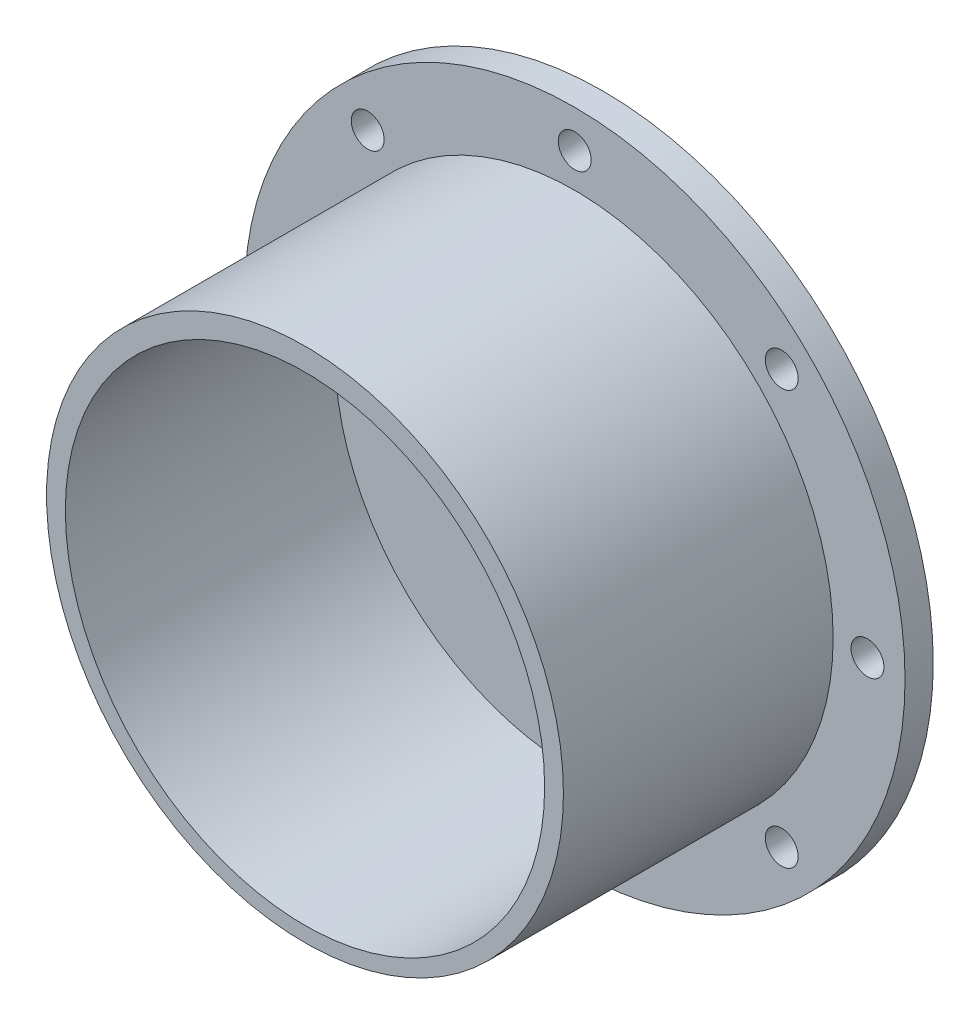
ISO-10303-21;
HEADER;
FILE_DESCRIPTION(('STEP AP214'),'2;1');
FILE_NAME('part.step','',(''),(''),'','','');
FILE_SCHEMA(('AUTOMOTIVE_DESIGN { 1 0 10303 214 1 1 1 1 }'));
ENDSEC;
DATA;
#1=APPLICATION_CONTEXT('core data for automotive mechanical design processes');
#2=APPLICATION_PROTOCOL_DEFINITION('international standard','automotive_design',2000,#1);
#3=PRODUCT_CONTEXT('',#1,'mechanical');
#4=PRODUCT('Part','Part','',(#3));
#5=PRODUCT_RELATED_PRODUCT_CATEGORY('part','',(#4));
#6=PRODUCT_DEFINITION_FORMATION('','',#4);
#7=PRODUCT_DEFINITION_CONTEXT('part definition',#1,'design');
#8=PRODUCT_DEFINITION('design','',#6,#7);
#9=PRODUCT_DEFINITION_SHAPE('','',#8);
#10=(LENGTH_UNIT() NAMED_UNIT(*) SI_UNIT(.MILLI.,.METRE.));
#11=(NAMED_UNIT(*) PLANE_ANGLE_UNIT() SI_UNIT($,.RADIAN.));
#12=(NAMED_UNIT(*) SI_UNIT($,.STERADIAN.) SOLID_ANGLE_UNIT());
#13=UNCERTAINTY_MEASURE_WITH_UNIT(LENGTH_MEASURE(1.E-05),#10,'distance_accuracy_value','');
#14=(GEOMETRIC_REPRESENTATION_CONTEXT(3) GLOBAL_UNCERTAINTY_ASSIGNED_CONTEXT((#13)) GLOBAL_UNIT_ASSIGNED_CONTEXT((#10,
#11,#12)) REPRESENTATION_CONTEXT('',''));
#15=CARTESIAN_POINT('',(0.,0.,0.));
#16=DIRECTION('',(0.,0.,1.));
#17=DIRECTION('',(1.,0.,0.));
#18=AXIS2_PLACEMENT_3D('',#15,#16,#17);
#19=CARTESIAN_POINT('',(0.,0.,3.));
#20=DIRECTION('',(0.,0.,1.));
#21=DIRECTION('',(1.,0.,0.));
#22=AXIS2_PLACEMENT_3D('',#19,#20,#21);
#23=PLANE('',#22);
#24=CARTESIAN_POINT('',(0.,0.,3.));
#25=DIRECTION('',(0.,0.,1.));
#26=DIRECTION('',(1.,0.,0.));
#27=AXIS2_PLACEMENT_3D('',#24,#25,#26);
#28=CIRCLE('',#27,27.5);
#29=CARTESIAN_POINT('',(27.5,0.,3.));
#30=VERTEX_POINT('',#29);
#31=EDGE_CURVE('E103',#30,#30,#28,.T.);
#32=ORIENTED_EDGE('',*,*,#31,.F.);
#33=EDGE_LOOP('',(#32));
#34=FACE_BOUND('',#33,.T.);
#35=CARTESIAN_POINT('',(-31.1506811180466,-2.21148158914477E-12,3.));
#36=DIRECTION('',(0.,0.,1.));
#37=DIRECTION('',(1.,0.,0.));
#38=AXIS2_PLACEMENT_3D('',#35,#36,#37);
#39=CIRCLE('',#38,1.75000000000307);
#40=CARTESIAN_POINT('',(-29.4006811180435,-2.21148158914477E-12,3.));
#41=VERTEX_POINT('',#40);
#42=EDGE_CURVE('E88',#41,#41,#39,.T.);
#43=ORIENTED_EDGE('',*,*,#42,.F.);
#44=EDGE_LOOP('',(#43));
#45=FACE_BOUND('',#44,.T.);
#46=CARTESIAN_POINT('',(4.41533346190503E-12,-31.1506811180488,3.));
#47=DIRECTION('',(0.,0.,1.));
#48=DIRECTION('',(1.,0.,0.));
#49=AXIS2_PLACEMENT_3D('',#46,#47,#48);
#50=CIRCLE('',#49,1.75000000000443);
#51=CARTESIAN_POINT('',(1.75000000000884,-31.1506811180488,3.));
#52=VERTEX_POINT('',#51);
#53=EDGE_CURVE('E76',#52,#52,#50,.T.);
#54=ORIENTED_EDGE('',*,*,#53,.F.);
#55=EDGE_LOOP('',(#54));
#56=FACE_BOUND('',#55,.T.);
#57=CARTESIAN_POINT('',(31.150681118051,2.20766673095252E-12,3.));
#58=DIRECTION('',(0.,0.,1.));
#59=DIRECTION('',(1.,0.,0.));
#60=AXIS2_PLACEMENT_3D('',#57,#58,#59);
#61=CIRCLE('',#60,1.75000000000157);
#62=CARTESIAN_POINT('',(32.9006811180526,2.20766673095252E-12,3.));
#63=VERTEX_POINT('',#62);
#64=EDGE_CURVE('E64',#63,#63,#61,.T.);
#65=ORIENTED_EDGE('',*,*,#64,.F.);
#66=EDGE_LOOP('',(#65));
#67=FACE_BOUND('',#66,.T.);
#68=CARTESIAN_POINT('',(0.,31.1506811180488,3.));
#69=DIRECTION('',(0.,0.,1.));
#70=DIRECTION('',(1.,0.,0.));
#71=AXIS2_PLACEMENT_3D('',#68,#69,#70);
#72=CIRCLE('',#71,1.75);
#73=CARTESIAN_POINT('',(1.75,31.1506811180488,3.));
#74=VERTEX_POINT('',#73);
#75=EDGE_CURVE('E53',#74,#74,#72,.T.);
#76=ORIENTED_EDGE('',*,*,#75,.F.);
#77=EDGE_LOOP('',(#76));
#78=FACE_BOUND('',#77,.T.);
#79=CARTESIAN_POINT('',(0.,0.,3.));
#80=DIRECTION('',(0.,0.,1.));
#81=DIRECTION('',(1.,0.,0.));
#82=AXIS2_PLACEMENT_3D('',#79,#80,#81);
#83=CIRCLE('',#82,35.15);
#84=CARTESIAN_POINT('',(35.15,0.,3.));
#85=VERTEX_POINT('',#84);
#86=EDGE_CURVE('E44',#85,#85,#83,.T.);
#87=ORIENTED_EDGE('',*,*,#86,.T.);
#88=EDGE_LOOP('',(#87));
#89=FACE_BOUND('',#88,.T.);
#90=CARTESIAN_POINT('',(22.0268578571527,22.0268578571536,3.));
#91=DIRECTION('',(0.,0.,1.));
#92=DIRECTION('',(1.,0.,0.));
#93=AXIS2_PLACEMENT_3D('',#90,#91,#92);
#94=CIRCLE('',#93,1.75000000000022);
#95=CARTESIAN_POINT('',(23.7768578571529,22.0268578571536,3.));
#96=VERTEX_POINT('',#95);
#97=EDGE_CURVE('E58',#96,#96,#94,.T.);
#98=ORIENTED_EDGE('',*,*,#97,.F.);
#99=EDGE_LOOP('',(#98));
#100=FACE_BOUND('',#99,.T.);
#101=CARTESIAN_POINT('',(22.0268578571558,-22.0268578571505,3.));
#102=DIRECTION('',(0.,0.,1.));
#103=DIRECTION('',(1.,0.,0.));
#104=AXIS2_PLACEMENT_3D('',#101,#102,#103);
#105=CIRCLE('',#104,1.75000000000331);
#106=CARTESIAN_POINT('',(23.7768578571591,-22.0268578571505,3.));
#107=VERTEX_POINT('',#106);
#108=EDGE_CURVE('E70',#107,#107,#105,.T.);
#109=ORIENTED_EDGE('',*,*,#108,.F.);
#110=EDGE_LOOP('',(#109));
#111=FACE_BOUND('',#110,.T.);
#112=CARTESIAN_POINT('',(-22.0268578571483,-22.0268578571536,3.));
#113=DIRECTION('',(0.,0.,1.));
#114=DIRECTION('',(1.,0.,0.));
#115=AXIS2_PLACEMENT_3D('',#112,#113,#114);
#116=CIRCLE('',#115,1.75000000000431);
#117=CARTESIAN_POINT('',(-20.276857857144,-22.0268578571536,3.));
#118=VERTEX_POINT('',#117);
#119=EDGE_CURVE('E82',#118,#118,#116,.T.);
#120=ORIENTED_EDGE('',*,*,#119,.F.);
#121=EDGE_LOOP('',(#120));
#122=FACE_BOUND('',#121,.T.);
#123=CARTESIAN_POINT('',(-22.0268578571514,22.0268578571505,3.));
#124=DIRECTION('',(0.,0.,1.));
#125=DIRECTION('',(1.,0.,0.));
#126=AXIS2_PLACEMENT_3D('',#123,#124,#125);
#127=CIRCLE('',#126,1.75000000000144);
#128=CARTESIAN_POINT('',(-20.27685785715,22.0268578571505,3.));
#129=VERTEX_POINT('',#128);
#130=EDGE_CURVE('E94',#129,#129,#127,.T.);
#131=ORIENTED_EDGE('',*,*,#130,.F.);
#132=EDGE_LOOP('',(#131));
#133=FACE_BOUND('',#132,.T.);
#134=ADVANCED_FACE('F37',(#34,#45,#56,#67,#78,#89,#100,#111,#122,#133),#23,.T.);
#135=CARTESIAN_POINT('',(0.,0.,0.));
#136=DIRECTION('',(0.,0.,1.));
#137=DIRECTION('',(1.,0.,0.));
#138=AXIS2_PLACEMENT_3D('',#135,#136,#137);
#139=PLANE('',#138);
#140=CARTESIAN_POINT('',(0.,0.,0.));
#141=DIRECTION('',(0.,0.,1.));
#142=DIRECTION('',(1.,0.,0.));
#143=AXIS2_PLACEMENT_3D('',#140,#141,#142);
#144=CIRCLE('',#143,35.15);
#145=CARTESIAN_POINT('',(35.15,0.,0.));
#146=VERTEX_POINT('',#145);
#147=EDGE_CURVE('E48',#146,#146,#144,.T.);
#148=ORIENTED_EDGE('',*,*,#147,.F.);
#149=EDGE_LOOP('',(#148));
#150=FACE_BOUND('',#149,.T.);
#151=CARTESIAN_POINT('',(0.,31.1506811180488,0.));
#152=DIRECTION('',(0.,0.,1.));
#153=DIRECTION('',(1.,0.,0.));
#154=AXIS2_PLACEMENT_3D('',#151,#152,#153);
#155=CIRCLE('',#154,1.75);
#156=CARTESIAN_POINT('',(1.75,31.1506811180488,0.));
#157=VERTEX_POINT('',#156);
#158=EDGE_CURVE('E55',#157,#157,#155,.T.);
#159=ORIENTED_EDGE('',*,*,#158,.T.);
#160=EDGE_LOOP('',(#159));
#161=FACE_BOUND('',#160,.T.);
#162=CARTESIAN_POINT('',(22.0268578571527,22.0268578571536,0.));
#163=DIRECTION('',(0.,0.,1.));
#164=DIRECTION('',(1.,0.,0.));
#165=AXIS2_PLACEMENT_3D('',#162,#163,#164);
#166=CIRCLE('',#165,1.75000000000022);
#167=CARTESIAN_POINT('',(23.7768578571529,22.0268578571536,0.));
#168=VERTEX_POINT('',#167);
#169=EDGE_CURVE('E61',#168,#168,#166,.T.);
#170=ORIENTED_EDGE('',*,*,#169,.T.);
#171=EDGE_LOOP('',(#170));
#172=FACE_BOUND('',#171,.T.);
#173=CARTESIAN_POINT('',(31.150681118051,2.20766673095252E-12,0.));
#174=DIRECTION('',(0.,0.,1.));
#175=DIRECTION('',(1.,0.,0.));
#176=AXIS2_PLACEMENT_3D('',#173,#174,#175);
#177=CIRCLE('',#176,1.75000000000157);
#178=CARTESIAN_POINT('',(32.9006811180526,2.20766673095252E-12,0.));
#179=VERTEX_POINT('',#178);
#180=EDGE_CURVE('E67',#179,#179,#177,.T.);
#181=ORIENTED_EDGE('',*,*,#180,.T.);
#182=EDGE_LOOP('',(#181));
#183=FACE_BOUND('',#182,.T.);
#184=CARTESIAN_POINT('',(22.0268578571558,-22.0268578571505,0.));
#185=DIRECTION('',(0.,0.,1.));
#186=DIRECTION('',(1.,0.,0.));
#187=AXIS2_PLACEMENT_3D('',#184,#185,#186);
#188=CIRCLE('',#187,1.75000000000331);
#189=CARTESIAN_POINT('',(23.7768578571591,-22.0268578571505,0.));
#190=VERTEX_POINT('',#189);
#191=EDGE_CURVE('E73',#190,#190,#188,.T.);
#192=ORIENTED_EDGE('',*,*,#191,.T.);
#193=EDGE_LOOP('',(#192));
#194=FACE_BOUND('',#193,.T.);
#195=CARTESIAN_POINT('',(4.41533346190503E-12,-31.1506811180488,0.));
#196=DIRECTION('',(0.,0.,1.));
#197=DIRECTION('',(1.,0.,0.));
#198=AXIS2_PLACEMENT_3D('',#195,#196,#197);
#199=CIRCLE('',#198,1.75000000000443);
#200=CARTESIAN_POINT('',(1.75000000000884,-31.1506811180488,0.));
#201=VERTEX_POINT('',#200);
#202=EDGE_CURVE('E79',#201,#201,#199,.T.);
#203=ORIENTED_EDGE('',*,*,#202,.T.);
#204=EDGE_LOOP('',(#203));
#205=FACE_BOUND('',#204,.T.);
#206=CARTESIAN_POINT('',(-22.0268578571483,-22.0268578571536,0.));
#207=DIRECTION('',(0.,0.,1.));
#208=DIRECTION('',(1.,0.,0.));
#209=AXIS2_PLACEMENT_3D('',#206,#207,#208);
#210=CIRCLE('',#209,1.75000000000431);
#211=CARTESIAN_POINT('',(-20.276857857144,-22.0268578571536,0.));
#212=VERTEX_POINT('',#211);
#213=EDGE_CURVE('E85',#212,#212,#210,.T.);
#214=ORIENTED_EDGE('',*,*,#213,.T.);
#215=EDGE_LOOP('',(#214));
#216=FACE_BOUND('',#215,.T.);
#217=CARTESIAN_POINT('',(-31.1506811180466,-2.21148158914477E-12,0.));
#218=DIRECTION('',(0.,0.,1.));
#219=DIRECTION('',(1.,0.,0.));
#220=AXIS2_PLACEMENT_3D('',#217,#218,#219);
#221=CIRCLE('',#220,1.75000000000307);
#222=CARTESIAN_POINT('',(-29.4006811180435,-2.21148158914477E-12,0.));
#223=VERTEX_POINT('',#222);
#224=EDGE_CURVE('E91',#223,#223,#221,.T.);
#225=ORIENTED_EDGE('',*,*,#224,.T.);
#226=EDGE_LOOP('',(#225));
#227=FACE_BOUND('',#226,.T.);
#228=CARTESIAN_POINT('',(-22.0268578571514,22.0268578571505,0.));
#229=DIRECTION('',(0.,0.,1.));
#230=DIRECTION('',(1.,0.,0.));
#231=AXIS2_PLACEMENT_3D('',#228,#229,#230);
#232=CIRCLE('',#231,1.75000000000144);
#233=CARTESIAN_POINT('',(-20.27685785715,22.0268578571505,0.));
#234=VERTEX_POINT('',#233);
#235=EDGE_CURVE('E97',#234,#234,#232,.T.);
#236=ORIENTED_EDGE('',*,*,#235,.T.);
#237=EDGE_LOOP('',(#236));
#238=FACE_BOUND('',#237,.T.);
#239=ADVANCED_FACE('F131',(#150,#161,#172,#183,#194,#205,#216,#227,#238),#139,.F.);
#240=CARTESIAN_POINT('',(0.,0.,3.));
#241=DIRECTION('',(0.,0.,-1.));
#242=DIRECTION('',(-1.,0.,0.));
#243=AXIS2_PLACEMENT_3D('',#240,#241,#242);
#244=CYLINDRICAL_SURFACE('',#243,35.15);
#245=ORIENTED_EDGE('',*,*,#86,.F.);
#246=EDGE_LOOP('',(#245));
#247=FACE_BOUND('',#246,.T.);
#248=ORIENTED_EDGE('',*,*,#147,.T.);
#249=EDGE_LOOP('',(#248));
#250=FACE_BOUND('',#249,.T.);
#251=ADVANCED_FACE('F39',(#247,#250),#244,.T.);
#252=CARTESIAN_POINT('',(0.,31.1506811180488,3.));
#253=DIRECTION('',(0.,0.,-1.));
#254=DIRECTION('',(-1.,0.,0.));
#255=AXIS2_PLACEMENT_3D('',#252,#253,#254);
#256=CYLINDRICAL_SURFACE('',#255,1.75);
#257=ORIENTED_EDGE('',*,*,#75,.T.);
#258=EDGE_LOOP('',(#257));
#259=FACE_BOUND('',#258,.T.);
#260=ORIENTED_EDGE('',*,*,#158,.F.);
#261=EDGE_LOOP('',(#260));
#262=FACE_BOUND('',#261,.T.);
#263=ADVANCED_FACE('F228',(#259,#262),#256,.F.);
#264=CARTESIAN_POINT('',(22.0268578571527,22.0268578571536,3.));
#265=DIRECTION('',(0.,0.,-1.));
#266=DIRECTION('',(-1.,0.,0.));
#267=AXIS2_PLACEMENT_3D('',#264,#265,#266);
#268=CYLINDRICAL_SURFACE('',#267,1.75000000000022);
#269=ORIENTED_EDGE('',*,*,#97,.T.);
#270=EDGE_LOOP('',(#269));
#271=FACE_BOUND('',#270,.T.);
#272=ORIENTED_EDGE('',*,*,#169,.F.);
#273=EDGE_LOOP('',(#272));
#274=FACE_BOUND('',#273,.T.);
#275=ADVANCED_FACE('F218',(#271,#274),#268,.F.);
#276=CARTESIAN_POINT('',(31.150681118051,2.20766673095252E-12,3.));
#277=DIRECTION('',(0.,0.,-1.));
#278=DIRECTION('',(-1.,0.,0.));
#279=AXIS2_PLACEMENT_3D('',#276,#277,#278);
#280=CYLINDRICAL_SURFACE('',#279,1.75000000000157);
#281=ORIENTED_EDGE('',*,*,#64,.T.);
#282=EDGE_LOOP('',(#281));
#283=FACE_BOUND('',#282,.T.);
#284=ORIENTED_EDGE('',*,*,#180,.F.);
#285=EDGE_LOOP('',(#284));
#286=FACE_BOUND('',#285,.T.);
#287=ADVANCED_FACE('F208',(#283,#286),#280,.F.);
#288=CARTESIAN_POINT('',(22.0268578571558,-22.0268578571505,3.));
#289=DIRECTION('',(0.,0.,-1.));
#290=DIRECTION('',(-1.,0.,0.));
#291=AXIS2_PLACEMENT_3D('',#288,#289,#290);
#292=CYLINDRICAL_SURFACE('',#291,1.75000000000331);
#293=ORIENTED_EDGE('',*,*,#108,.T.);
#294=EDGE_LOOP('',(#293));
#295=FACE_BOUND('',#294,.T.);
#296=ORIENTED_EDGE('',*,*,#191,.F.);
#297=EDGE_LOOP('',(#296));
#298=FACE_BOUND('',#297,.T.);
#299=ADVANCED_FACE('F198',(#295,#298),#292,.F.);
#300=CARTESIAN_POINT('',(4.41533346190503E-12,-31.1506811180488,3.));
#301=DIRECTION('',(0.,0.,-1.));
#302=DIRECTION('',(-1.,0.,0.));
#303=AXIS2_PLACEMENT_3D('',#300,#301,#302);
#304=CYLINDRICAL_SURFACE('',#303,1.75000000000443);
#305=ORIENTED_EDGE('',*,*,#53,.T.);
#306=EDGE_LOOP('',(#305));
#307=FACE_BOUND('',#306,.T.);
#308=ORIENTED_EDGE('',*,*,#202,.F.);
#309=EDGE_LOOP('',(#308));
#310=FACE_BOUND('',#309,.T.);
#311=ADVANCED_FACE('F188',(#307,#310),#304,.F.);
#312=CARTESIAN_POINT('',(-22.0268578571483,-22.0268578571536,3.));
#313=DIRECTION('',(0.,0.,-1.));
#314=DIRECTION('',(-1.,0.,0.));
#315=AXIS2_PLACEMENT_3D('',#312,#313,#314);
#316=CYLINDRICAL_SURFACE('',#315,1.75000000000431);
#317=ORIENTED_EDGE('',*,*,#119,.T.);
#318=EDGE_LOOP('',(#317));
#319=FACE_BOUND('',#318,.T.);
#320=ORIENTED_EDGE('',*,*,#213,.F.);
#321=EDGE_LOOP('',(#320));
#322=FACE_BOUND('',#321,.T.);
#323=ADVANCED_FACE('F178',(#319,#322),#316,.F.);
#324=CARTESIAN_POINT('',(-31.1506811180466,-2.21148158914477E-12,3.));
#325=DIRECTION('',(0.,0.,-1.));
#326=DIRECTION('',(-1.,0.,0.));
#327=AXIS2_PLACEMENT_3D('',#324,#325,#326);
#328=CYLINDRICAL_SURFACE('',#327,1.75000000000307);
#329=ORIENTED_EDGE('',*,*,#42,.T.);
#330=EDGE_LOOP('',(#329));
#331=FACE_BOUND('',#330,.T.);
#332=ORIENTED_EDGE('',*,*,#224,.F.);
#333=EDGE_LOOP('',(#332));
#334=FACE_BOUND('',#333,.T.);
#335=ADVANCED_FACE('F126',(#331,#334),#328,.F.);
#336=CARTESIAN_POINT('',(-22.0268578571514,22.0268578571505,3.));
#337=DIRECTION('',(0.,0.,-1.));
#338=DIRECTION('',(-1.,0.,0.));
#339=AXIS2_PLACEMENT_3D('',#336,#337,#338);
#340=CYLINDRICAL_SURFACE('',#339,1.75000000000144);
#341=ORIENTED_EDGE('',*,*,#130,.T.);
#342=EDGE_LOOP('',(#341));
#343=FACE_BOUND('',#342,.T.);
#344=ORIENTED_EDGE('',*,*,#235,.F.);
#345=EDGE_LOOP('',(#344));
#346=FACE_BOUND('',#345,.T.);
#347=ADVANCED_FACE('F117',(#343,#346),#340,.F.);
#348=CARTESIAN_POINT('',(0.,0.,31.7));
#349=DIRECTION('',(0.,0.,1.));
#350=DIRECTION('',(1.,0.,0.));
#351=AXIS2_PLACEMENT_3D('',#348,#349,#350);
#352=PLANE('',#351);
#353=CARTESIAN_POINT('',(0.,0.,31.7));
#354=DIRECTION('',(0.,0.,1.));
#355=DIRECTION('',(1.,0.,0.));
#356=AXIS2_PLACEMENT_3D('',#353,#354,#355);
#357=CIRCLE('',#356,27.5);
#358=CARTESIAN_POINT('',(27.5,0.,31.7));
#359=VERTEX_POINT('',#358);
#360=EDGE_CURVE('E100',#359,#359,#357,.T.);
#361=ORIENTED_EDGE('',*,*,#360,.T.);
#362=EDGE_LOOP('',(#361));
#363=FACE_BOUND('',#362,.T.);
#364=CARTESIAN_POINT('',(0.,-0.400500667546646,31.7));
#365=DIRECTION('',(0.,0.,1.));
#366=DIRECTION('',(1.,0.,0.));
#367=AXIS2_PLACEMENT_3D('',#364,#365,#366);
#368=CIRCLE('',#367,25.5);
#369=CARTESIAN_POINT('',(25.5,-0.400500667546646,31.7));
#370=VERTEX_POINT('',#369);
#371=EDGE_CURVE('E106',#370,#370,#368,.T.);
#372=ORIENTED_EDGE('',*,*,#371,.F.);
#373=EDGE_LOOP('',(#372));
#374=FACE_BOUND('',#373,.T.);
#375=ADVANCED_FACE('F114',(#363,#374),#352,.T.);
#376=CARTESIAN_POINT('',(0.,0.,31.7));
#377=DIRECTION('',(0.,0.,-1.));
#378=DIRECTION('',(-1.,0.,0.));
#379=AXIS2_PLACEMENT_3D('',#376,#377,#378);
#380=CYLINDRICAL_SURFACE('',#379,27.5);
#381=ORIENTED_EDGE('',*,*,#360,.F.);
#382=EDGE_LOOP('',(#381));
#383=FACE_BOUND('',#382,.T.);
#384=ORIENTED_EDGE('',*,*,#31,.T.);
#385=EDGE_LOOP('',(#384));
#386=FACE_BOUND('',#385,.T.);
#387=ADVANCED_FACE('F116',(#383,#386),#380,.T.);
#388=CARTESIAN_POINT('',(0.,-0.400500667546646,31.7));
#389=DIRECTION('',(0.,0.,-1.));
#390=DIRECTION('',(-1.,0.,0.));
#391=AXIS2_PLACEMENT_3D('',#388,#389,#390);
#392=CYLINDRICAL_SURFACE('',#391,25.5);
#393=ORIENTED_EDGE('',*,*,#371,.T.);
#394=EDGE_LOOP('',(#393));
#395=FACE_BOUND('',#394,.T.);
#396=CARTESIAN_POINT('',(0.,-0.400500667546646,3.));
#397=DIRECTION('',(0.,0.,1.));
#398=DIRECTION('',(1.,0.,0.));
#399=AXIS2_PLACEMENT_3D('',#396,#397,#398);
#400=CIRCLE('',#399,25.5);
#401=CARTESIAN_POINT('',(25.5,-0.400500667546646,3.));
#402=VERTEX_POINT('',#401);
#403=EDGE_CURVE('E10',#402,#402,#400,.F.);
#404=ORIENTED_EDGE('',*,*,#403,.T.);
#405=EDGE_LOOP('',(#404));
#406=FACE_BOUND('',#405,.T.);
#407=ADVANCED_FACE('F112',(#395,#406),#392,.F.);
#408=ORIENTED_EDGE('',*,*,#403,.F.);
#409=EDGE_LOOP('',(#408));
#410=FACE_BOUND('',#409,.T.);
#411=ADVANCED_FACE('F134',(#410),#23,.T.);
#412=CLOSED_SHELL('',(#134,#239,#251,#263,#275,#287,#299,#311,#323,#335,#347,#375,#387,#407,#411));
#413=MANIFOLD_SOLID_BREP('B2',#412);
#414=ADVANCED_BREP_SHAPE_REPRESENTATION('',(#18,#413),#14);
#415=SHAPE_DEFINITION_REPRESENTATION(#9,#414);
ENDSEC;
END-ISO-10303-21;
